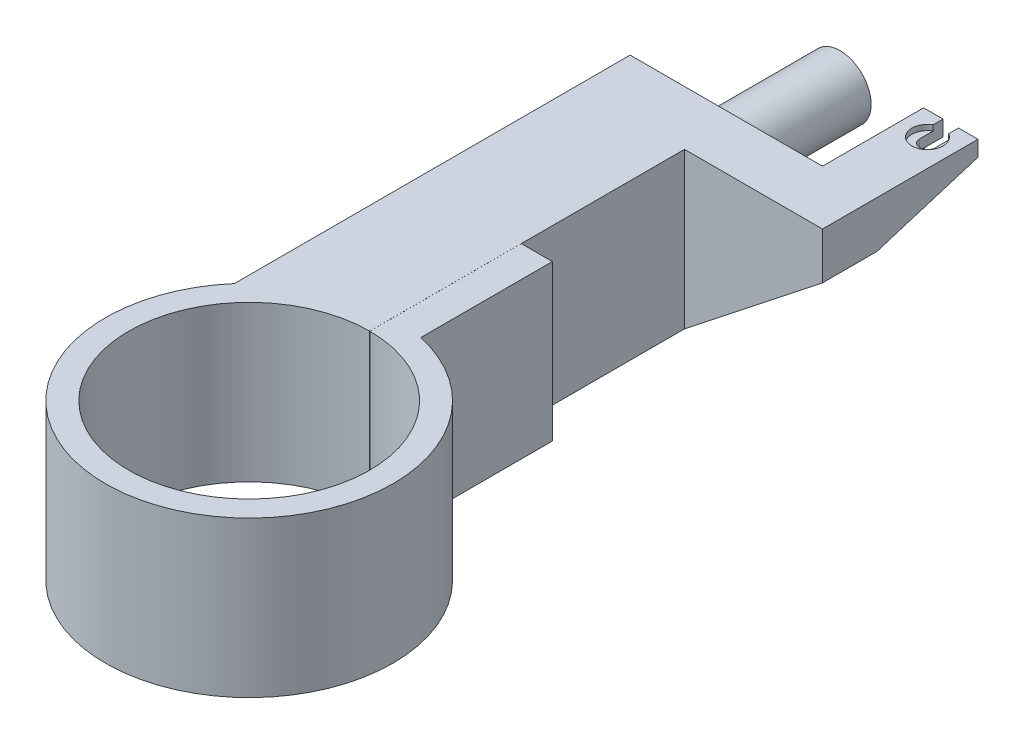
ISO-10303-21;
HEADER;
FILE_DESCRIPTION(('STEP AP214'),'2;1');
FILE_NAME('part.step','',(''),(''),'','','');
FILE_SCHEMA(('AUTOMOTIVE_DESIGN { 1 0 10303 214 1 1 1 1 }'));
ENDSEC;
DATA;
#1=APPLICATION_CONTEXT('core data for automotive mechanical design processes');
#2=APPLICATION_PROTOCOL_DEFINITION('international standard','automotive_design',2000,#1);
#3=PRODUCT_CONTEXT('',#1,'mechanical');
#4=PRODUCT('Part','Part','',(#3));
#5=PRODUCT_RELATED_PRODUCT_CATEGORY('part','',(#4));
#6=PRODUCT_DEFINITION_FORMATION('','',#4);
#7=PRODUCT_DEFINITION_CONTEXT('part definition',#1,'design');
#8=PRODUCT_DEFINITION('design','',#6,#7);
#9=PRODUCT_DEFINITION_SHAPE('','',#8);
#10=(LENGTH_UNIT() NAMED_UNIT(*) SI_UNIT(.MILLI.,.METRE.));
#11=(NAMED_UNIT(*) PLANE_ANGLE_UNIT() SI_UNIT($,.RADIAN.));
#12=(NAMED_UNIT(*) SI_UNIT($,.STERADIAN.) SOLID_ANGLE_UNIT());
#13=UNCERTAINTY_MEASURE_WITH_UNIT(LENGTH_MEASURE(1.E-05),#10,'distance_accuracy_value','');
#14=(GEOMETRIC_REPRESENTATION_CONTEXT(3) GLOBAL_UNCERTAINTY_ASSIGNED_CONTEXT((#13)) GLOBAL_UNIT_ASSIGNED_CONTEXT((#10,
#11,#12)) REPRESENTATION_CONTEXT('',''));
#15=CARTESIAN_POINT('',(0.,0.,0.));
#16=DIRECTION('',(0.,0.,1.));
#17=DIRECTION('',(1.,0.,0.));
#18=AXIS2_PLACEMENT_3D('',#15,#16,#17);
#19=CARTESIAN_POINT('',(-6.99999999999999,10.,83.));
#20=DIRECTION('',(0.,0.,-1.));
#21=DIRECTION('',(-1.,0.,0.));
#22=AXIS2_PLACEMENT_3D('',#19,#20,#21);
#23=CYLINDRICAL_SURFACE('',#22,4.);
#24=CARTESIAN_POINT('',(-6.99999999999999,10.,83.));
#25=DIRECTION('',(0.,0.,1.));
#26=DIRECTION('',(1.,0.,0.));
#27=AXIS2_PLACEMENT_3D('',#24,#25,#26);
#28=CIRCLE('',#27,4.);
#29=CARTESIAN_POINT('',(-2.99999999999999,10.,83.));
#30=VERTEX_POINT('',#29);
#31=EDGE_CURVE('E42',#30,#30,#28,.T.);
#32=ORIENTED_EDGE('',*,*,#31,.T.);
#33=EDGE_LOOP('',(#32));
#34=FACE_BOUND('',#33,.T.);
#35=CARTESIAN_POINT('',(-6.99999999999999,10.,103.));
#36=DIRECTION('',(0.,0.,-1.));
#37=DIRECTION('',(-1.,0.,0.));
#38=AXIS2_PLACEMENT_3D('',#35,#36,#37);
#39=CIRCLE('',#38,4.);
#40=CARTESIAN_POINT('',(-11.,10.,103.));
#41=VERTEX_POINT('',#40);
#42=EDGE_CURVE('E473',#41,#41,#39,.F.);
#43=ORIENTED_EDGE('',*,*,#42,.F.);
#44=EDGE_LOOP('',(#43));
#45=FACE_BOUND('',#44,.T.);
#46=ADVANCED_FACE('F39',(#34,#45),#23,.T.);
#47=CARTESIAN_POINT('',(14.249394375664,18.,93.));
#48=DIRECTION('',(0.,1.,0.));
#49=DIRECTION('',(0.,0.,-1.));
#50=AXIS2_PLACEMENT_3D('',#47,#48,#49);
#51=CYLINDRICAL_SURFACE('',#50,1.);
#52=DIRECTION('',(0.,1.,0.));
#53=VECTOR('',#52,1.);
#54=CARTESIAN_POINT('',(15.249394375664,18.,93.));
#55=LINE('',#54,#53);
#56=CARTESIAN_POINT('',(15.249394375664,18.,93.));
#57=VERTEX_POINT('',#56);
#58=CARTESIAN_POINT('',(15.249394375664,19.3,93.));
#59=VERTEX_POINT('',#58);
#60=EDGE_CURVE('E427',#57,#59,#55,.T.);
#61=ORIENTED_EDGE('',*,*,#60,.F.);
#62=CARTESIAN_POINT('',(14.249394375664,18.,93.));
#63=DIRECTION('',(0.,1.,0.));
#64=DIRECTION('',(0.,0.,-1.));
#65=AXIS2_PLACEMENT_3D('',#62,#63,#64);
#66=CIRCLE('',#65,1.);
#67=CARTESIAN_POINT('',(13.249394375664,18.,93.));
#68=VERTEX_POINT('',#67);
#69=EDGE_CURVE('E390',#68,#57,#66,.T.);
#70=ORIENTED_EDGE('',*,*,#69,.F.);
#71=DIRECTION('',(0.,1.,0.));
#72=VECTOR('',#71,1.);
#73=CARTESIAN_POINT('',(13.249394375664,18.,93.));
#74=LINE('',#73,#72);
#75=CARTESIAN_POINT('',(13.249394375664,19.3,93.));
#76=VERTEX_POINT('',#75);
#77=EDGE_CURVE('E430',#68,#76,#74,.T.);
#78=ORIENTED_EDGE('',*,*,#77,.T.);
#79=CARTESIAN_POINT('',(14.249394375664,19.3,93.));
#80=DIRECTION('',(0.,-1.,0.));
#81=DIRECTION('',(0.,0.,-1.));
#82=AXIS2_PLACEMENT_3D('',#79,#80,#81);
#83=CIRCLE('',#82,1.);
#84=EDGE_CURVE('E328',#59,#76,#83,.T.);
#85=ORIENTED_EDGE('',*,*,#84,.F.);
#86=EDGE_LOOP('',(#61,#70,#78,#85));
#87=FACE_BOUND('',#86,.T.);
#88=ADVANCED_FACE('F497',(#87),#51,.F.);
#89=CARTESIAN_POINT('',(2.,18.,108.));
#90=DIRECTION('',(-1.,0.,0.));
#91=DIRECTION('',(0.,0.,-1.));
#92=AXIS2_PLACEMENT_3D('',#89,#90,#91);
#93=PLANE('',#92);
#94=DIRECTION('',(0.,0.,1.));
#95=VECTOR('',#94,1.);
#96=CARTESIAN_POINT('',(2.,18.,108.));
#97=LINE('',#96,#95);
#98=CARTESIAN_POINT('',(2.,18.,105.));
#99=VERTEX_POINT('',#98);
#100=CARTESIAN_POINT('',(2.,18.,108.));
#101=VERTEX_POINT('',#100);
#102=EDGE_CURVE('E339',#99,#101,#97,.T.);
#103=ORIENTED_EDGE('',*,*,#102,.T.);
#104=DIRECTION('',(0.,1.,0.));
#105=VECTOR('',#104,1.);
#106=CARTESIAN_POINT('',(2.,18.,108.));
#107=LINE('',#106,#105);
#108=CARTESIAN_POINT('',(2.,1.5775186131641,108.));
#109=VERTEX_POINT('',#108);
#110=EDGE_CURVE('E372',#109,#101,#107,.T.);
#111=ORIENTED_EDGE('',*,*,#110,.F.);
#112=DIRECTION('',(0.,0.,1.));
#113=VECTOR('',#112,1.);
#114=CARTESIAN_POINT('',(2.,1.5775186131641,108.));
#115=LINE('',#114,#113);
#116=CARTESIAN_POINT('',(2.,1.5775186131641,105.));
#117=VERTEX_POINT('',#116);
#118=EDGE_CURVE('E355',#117,#109,#115,.T.);
#119=ORIENTED_EDGE('',*,*,#118,.F.);
#120=DIRECTION('',(0.,1.,0.));
#121=VECTOR('',#120,1.);
#122=CARTESIAN_POINT('',(2.,18.,105.));
#123=LINE('',#122,#121);
#124=EDGE_CURVE('E371',#117,#99,#123,.T.);
#125=ORIENTED_EDGE('',*,*,#124,.T.);
#126=EDGE_LOOP('',(#103,#111,#119,#125));
#127=FACE_BOUND('',#126,.T.);
#128=ADVANCED_FACE('F542',(#127),#93,.F.);
#129=CARTESIAN_POINT('',(2.,18.,108.));
#130=DIRECTION('',(0.,0.,1.));
#131=DIRECTION('',(-1.,0.,0.));
#132=AXIS2_PLACEMENT_3D('',#129,#130,#131);
#133=PLANE('',#132);
#134=DIRECTION('',(1.,0.,0.));
#135=VECTOR('',#134,1.);
#136=CARTESIAN_POINT('',(15.749394375664,18.,108.));
#137=LINE('',#136,#135);
#138=CARTESIAN_POINT('',(15.749394375664,18.,108.));
#139=VERTEX_POINT('',#138);
#140=EDGE_CURVE('E336',#101,#139,#137,.T.);
#141=ORIENTED_EDGE('',*,*,#140,.T.);
#142=DIRECTION('',(0.,1.,0.));
#143=VECTOR('',#142,1.);
#144=CARTESIAN_POINT('',(15.749394375664,18.,108.));
#145=LINE('',#144,#143);
#146=CARTESIAN_POINT('',(15.749394375664,12.4224813868359,108.));
#147=VERTEX_POINT('',#146);
#148=EDGE_CURVE('E376',#147,#139,#145,.T.);
#149=ORIENTED_EDGE('',*,*,#148,.F.);
#150=DIRECTION('',(0.785155480925612,0.619298692693978,0.));
#151=VECTOR('',#150,1.);
#152=CARTESIAN_POINT('',(9.98536199063244,7.87604719970196,108.));
#153=LINE('',#152,#151);
#154=EDGE_CURVE('E358',#109,#147,#153,.T.);
#155=ORIENTED_EDGE('',*,*,#154,.F.);
#156=ORIENTED_EDGE('',*,*,#110,.T.);
#157=EDGE_LOOP('',(#141,#149,#155,#156));
#158=FACE_BOUND('',#157,.T.);
#159=ADVANCED_FACE('F538',(#158),#133,.F.);
#160=CARTESIAN_POINT('',(15.749394375664,18.,108.));
#161=DIRECTION('',(1.,0.,0.));
#162=DIRECTION('',(0.,0.,1.));
#163=AXIS2_PLACEMENT_3D('',#160,#161,#162);
#164=PLANE('',#163);
#165=DIRECTION('',(0.,1.,0.));
#166=VECTOR('',#165,1.);
#167=CARTESIAN_POINT('',(15.749394375664,18.,103.));
#168=LINE('',#167,#166);
#169=CARTESIAN_POINT('',(15.749394375664,12.4224813868359,103.));
#170=VERTEX_POINT('',#169);
#171=CARTESIAN_POINT('',(15.749394375664,14.,103.));
#172=VERTEX_POINT('',#171);
#173=EDGE_CURVE('E322',#170,#172,#168,.T.);
#174=ORIENTED_EDGE('',*,*,#173,.F.);
#175=DIRECTION('',(0.,0.,-1.));
#176=VECTOR('',#175,1.);
#177=CARTESIAN_POINT('',(15.749394375664,12.4224813868359,108.));
#178=LINE('',#177,#176);
#179=EDGE_CURVE('E363',#147,#170,#178,.T.);
#180=ORIENTED_EDGE('',*,*,#179,.F.);
#181=ORIENTED_EDGE('',*,*,#148,.T.);
#182=DIRECTION('',(0.,0.,1.));
#183=VECTOR('',#182,1.);
#184=CARTESIAN_POINT('',(15.749394375664,18.,166.));
#185=LINE('',#184,#183);
#186=CARTESIAN_POINT('',(15.749394375664,18.,90.));
#187=VERTEX_POINT('',#186);
#188=EDGE_CURVE('E369',#187,#139,#185,.T.);
#189=ORIENTED_EDGE('',*,*,#188,.F.);
#190=DIRECTION('',(0.,0.294085848837523,-0.95577900872195));
#191=VECTOR('',#190,1.);
#192=CARTESIAN_POINT('',(15.749394375664,12.9405405405405,106.443243243243));
#193=LINE('',#192,#191);
#194=EDGE_CURVE('E313',#172,#187,#193,.T.);
#195=ORIENTED_EDGE('',*,*,#194,.F.);
#196=EDGE_LOOP('',(#174,#180,#181,#189,#195));
#197=FACE_BOUND('',#196,.T.);
#198=ADVANCED_FACE('F535',(#197),#164,.F.);
#199=CARTESIAN_POINT('',(12.749394375664,18.,105.));
#200=DIRECTION('',(-1.,0.,0.));
#201=DIRECTION('',(0.,0.,-1.));
#202=AXIS2_PLACEMENT_3D('',#199,#200,#201);
#203=PLANE('',#202);
#204=DIRECTION('',(0.,0.,1.));
#205=VECTOR('',#204,1.);
#206=CARTESIAN_POINT('',(12.749394375664,18.,166.));
#207=LINE('',#206,#205);
#208=CARTESIAN_POINT('',(12.749394375664,18.,90.));
#209=VERTEX_POINT('',#208);
#210=CARTESIAN_POINT('',(12.749394375664,18.,105.));
#211=VERTEX_POINT('',#210);
#212=EDGE_CURVE('E366',#209,#211,#207,.T.);
#213=ORIENTED_EDGE('',*,*,#212,.T.);
#214=DIRECTION('',(0.,1.,0.));
#215=VECTOR('',#214,1.);
#216=CARTESIAN_POINT('',(12.749394375664,18.,105.));
#217=LINE('',#216,#215);
#218=CARTESIAN_POINT('',(12.749394375664,10.0562034670898,105.));
#219=VERTEX_POINT('',#218);
#220=EDGE_CURVE('E379',#219,#211,#217,.T.);
#221=ORIENTED_EDGE('',*,*,#220,.F.);
#222=DIRECTION('',(0.,0.,1.));
#223=VECTOR('',#222,1.);
#224=CARTESIAN_POINT('',(12.749394375664,10.0562034670898,105.));
#225=LINE('',#224,#223);
#226=CARTESIAN_POINT('',(12.749394375664,10.0562034670898,103.));
#227=VERTEX_POINT('',#226);
#228=EDGE_CURVE('E350',#227,#219,#225,.T.);
#229=ORIENTED_EDGE('',*,*,#228,.F.);
#230=DIRECTION('',(0.,-1.,0.));
#231=VECTOR('',#230,1.);
#232=CARTESIAN_POINT('',(12.749394375664,18.,103.));
#233=LINE('',#232,#231);
#234=CARTESIAN_POINT('',(12.749394375664,14.,103.));
#235=VERTEX_POINT('',#234);
#236=EDGE_CURVE('E319',#235,#227,#233,.T.);
#237=ORIENTED_EDGE('',*,*,#236,.F.);
#238=DIRECTION('',(0.,-0.294085848837523,0.95577900872195));
#239=VECTOR('',#238,1.);
#240=CARTESIAN_POINT('',(12.749394375664,13.7837837837838,103.702702702703));
#241=LINE('',#240,#239);
#242=EDGE_CURVE('E310',#209,#235,#241,.T.);
#243=ORIENTED_EDGE('',*,*,#242,.F.);
#244=EDGE_LOOP('',(#213,#221,#229,#237,#243));
#245=FACE_BOUND('',#244,.T.);
#246=ADVANCED_FACE('F509',(#245),#203,.F.);
#247=CARTESIAN_POINT('',(2.,18.,105.));
#248=DIRECTION('',(0.,0.,-1.));
#249=DIRECTION('',(1.,0.,0.));
#250=AXIS2_PLACEMENT_3D('',#247,#248,#249);
#251=PLANE('',#250);
#252=DIRECTION('',(-1.,0.,0.));
#253=VECTOR('',#252,1.);
#254=CARTESIAN_POINT('',(2.,18.,105.));
#255=LINE('',#254,#253);
#256=EDGE_CURVE('E342',#211,#99,#255,.T.);
#257=ORIENTED_EDGE('',*,*,#256,.T.);
#258=ORIENTED_EDGE('',*,*,#124,.F.);
#259=DIRECTION('',(-0.785155480925612,-0.619298692693978,0.));
#260=VECTOR('',#259,1.);
#261=CARTESIAN_POINT('',(9.98536199063244,7.87604719970196,105.));
#262=LINE('',#261,#260);
#263=EDGE_CURVE('E476',#219,#117,#262,.T.);
#264=ORIENTED_EDGE('',*,*,#263,.F.);
#265=ORIENTED_EDGE('',*,*,#220,.T.);
#266=EDGE_LOOP('',(#257,#258,#264,#265));
#267=FACE_BOUND('',#266,.T.);
#268=ADVANCED_FACE('F546',(#267),#251,.F.);
#269=CARTESIAN_POINT('',(0.,20.,150.5));
#270=DIRECTION('',(-1.,0.,0.));
#271=DIRECTION('',(0.,0.,-1.));
#272=AXIS2_PLACEMENT_3D('',#269,#270,#271);
#273=PLANE('',#272);
#274=DIRECTION('',(0.,1.,0.));
#275=VECTOR('',#274,1.);
#276=CARTESIAN_POINT('',(0.,18.,110.));
#277=LINE('',#276,#275);
#278=CARTESIAN_POINT('',(0.,0.,110.));
#279=VERTEX_POINT('',#278);
#280=CARTESIAN_POINT('',(0.,20.,110.));
#281=VERTEX_POINT('',#280);
#282=EDGE_CURVE('E418',#279,#281,#277,.T.);
#283=ORIENTED_EDGE('',*,*,#282,.T.);
#284=DIRECTION('',(0.,0.,1.));
#285=VECTOR('',#284,1.);
#286=CARTESIAN_POINT('',(0.,20.,150.5));
#287=LINE('',#286,#285);
#288=CARTESIAN_POINT('',(0.,20.,150.5));
#289=VERTEX_POINT('',#288);
#290=EDGE_CURVE('E255',#281,#289,#287,.T.);
#291=ORIENTED_EDGE('',*,*,#290,.T.);
#292=DIRECTION('',(0.,-1.,0.));
#293=VECTOR('',#292,1.);
#294=CARTESIAN_POINT('',(0.,20.,150.5));
#295=LINE('',#294,#293);
#296=CARTESIAN_POINT('',(0.,0.,150.5));
#297=VERTEX_POINT('',#296);
#298=EDGE_CURVE('E251',#289,#297,#295,.T.);
#299=ORIENTED_EDGE('',*,*,#298,.T.);
#300=DIRECTION('',(0.,0.,1.));
#301=VECTOR('',#300,1.);
#302=CARTESIAN_POINT('',(0.,0.,150.5));
#303=LINE('',#302,#301);
#304=EDGE_CURVE('E463',#279,#297,#303,.T.);
#305=ORIENTED_EDGE('',*,*,#304,.F.);
#306=EDGE_LOOP('',(#283,#291,#299,#305));
#307=FACE_BOUND('',#306,.T.);
#308=ADVANCED_FACE('F576',(#307),#273,.F.);
#309=CARTESIAN_POINT('',(14.249394375664,18.,93.));
#310=DIRECTION('',(0.,1.,0.));
#311=DIRECTION('',(0.,0.,-1.));
#312=AXIS2_PLACEMENT_3D('',#309,#310,#311);
#313=PLANE('',#312);
#314=ORIENTED_EDGE('',*,*,#188,.T.);
#315=ORIENTED_EDGE('',*,*,#140,.F.);
#316=ORIENTED_EDGE('',*,*,#102,.F.);
#317=ORIENTED_EDGE('',*,*,#256,.F.);
#318=ORIENTED_EDGE('',*,*,#212,.F.);
#319=DIRECTION('',(1.,0.,0.));
#320=VECTOR('',#319,1.);
#321=CARTESIAN_POINT('',(10.749394375664,18.,90.));
#322=LINE('',#321,#320);
#323=CARTESIAN_POINT('',(13.249394375664,18.,90.));
#324=VERTEX_POINT('',#323);
#325=EDGE_CURVE('E384',#209,#324,#322,.T.);
#326=ORIENTED_EDGE('',*,*,#325,.T.);
#327=DIRECTION('',(0.,0.,1.));
#328=VECTOR('',#327,1.);
#329=CARTESIAN_POINT('',(13.249394375664,18.,93.));
#330=LINE('',#329,#328);
#331=EDGE_CURVE('E387',#324,#68,#330,.T.);
#332=ORIENTED_EDGE('',*,*,#331,.T.);
#333=ORIENTED_EDGE('',*,*,#69,.T.);
#334=DIRECTION('',(0.,0.,-1.));
#335=VECTOR('',#334,1.);
#336=CARTESIAN_POINT('',(15.249394375664,18.,93.));
#337=LINE('',#336,#335);
#338=CARTESIAN_POINT('',(15.249394375664,18.,90.));
#339=VERTEX_POINT('',#338);
#340=EDGE_CURVE('E393',#57,#339,#337,.T.);
#341=ORIENTED_EDGE('',*,*,#340,.T.);
#342=DIRECTION('',(1.,0.,0.));
#343=VECTOR('',#342,1.);
#344=CARTESIAN_POINT('',(15.249394375664,18.,90.));
#345=LINE('',#344,#343);
#346=EDGE_CURVE('E396',#339,#187,#345,.T.);
#347=ORIENTED_EDGE('',*,*,#346,.T.);
#348=EDGE_LOOP('',(#314,#315,#316,#317,#318,#326,#332,#333,#341,#347));
#349=FACE_BOUND('',#348,.T.);
#350=ADVANCED_FACE('F502',(#349),#313,.F.);
#351=CARTESIAN_POINT('',(-14.,20.,103.));
#352=DIRECTION('',(0.,0.,1.));
#353=DIRECTION('',(-1.,0.,0.));
#354=AXIS2_PLACEMENT_3D('',#351,#352,#353);
#355=PLANE('',#354);
#356=DIRECTION('',(1.,0.,0.));
#357=VECTOR('',#356,1.);
#358=CARTESIAN_POINT('',(-13.1780414969752,14.,103.));
#359=LINE('',#358,#357);
#360=CARTESIAN_POINT('',(10.749394375664,14.,103.));
#361=VERTEX_POINT('',#360);
#362=EDGE_CURVE('E317',#361,#235,#359,.T.);
#363=ORIENTED_EDGE('',*,*,#362,.T.);
#364=ORIENTED_EDGE('',*,*,#236,.T.);
#365=DIRECTION('',(0.785155480925612,0.619298692693978,0.));
#366=VECTOR('',#365,1.);
#367=CARTESIAN_POINT('',(1.09434744878945,0.863176734867015,103.));
#368=LINE('',#367,#366);
#369=CARTESIAN_POINT('',(0.,0.,103.));
#370=VERTEX_POINT('',#369);
#371=EDGE_CURVE('E361',#370,#227,#368,.T.);
#372=ORIENTED_EDGE('',*,*,#371,.F.);
#373=DIRECTION('',(1.,0.,0.));
#374=VECTOR('',#373,1.);
#375=CARTESIAN_POINT('',(-14.,0.,103.));
#376=LINE('',#375,#374);
#377=CARTESIAN_POINT('',(-14.,0.,103.));
#378=VERTEX_POINT('',#377);
#379=EDGE_CURVE('E460',#378,#370,#376,.T.);
#380=ORIENTED_EDGE('',*,*,#379,.F.);
#381=DIRECTION('',(0.,-1.,0.));
#382=VECTOR('',#381,1.);
#383=CARTESIAN_POINT('',(-14.,20.,103.));
#384=LINE('',#383,#382);
#385=CARTESIAN_POINT('',(-14.,20.,103.));
#386=VERTEX_POINT('',#385);
#387=EDGE_CURVE('E468',#386,#378,#384,.T.);
#388=ORIENTED_EDGE('',*,*,#387,.F.);
#389=DIRECTION('',(1.,0.,0.));
#390=VECTOR('',#389,1.);
#391=CARTESIAN_POINT('',(-14.,20.,103.));
#392=LINE('',#391,#390);
#393=CARTESIAN_POINT('',(10.749394375664,20.,103.));
#394=VERTEX_POINT('',#393);
#395=EDGE_CURVE('E452',#386,#394,#392,.T.);
#396=ORIENTED_EDGE('',*,*,#395,.T.);
#397=DIRECTION('',(0.,1.,0.));
#398=VECTOR('',#397,1.);
#399=CARTESIAN_POINT('',(10.749394375664,18.,103.));
#400=LINE('',#399,#398);
#401=EDGE_CURVE('E399',#361,#394,#400,.T.);
#402=ORIENTED_EDGE('',*,*,#401,.F.);
#403=EDGE_LOOP('',(#363,#364,#372,#380,#388,#396,#402));
#404=FACE_BOUND('',#403,.T.);
#405=ORIENTED_EDGE('',*,*,#42,.T.);
#406=EDGE_LOOP('',(#405));
#407=FACE_BOUND('',#406,.T.);
#408=ADVANCED_FACE('F552',(#404,#407),#355,.F.);
#409=CARTESIAN_POINT('',(0.,20.,166.));
#410=DIRECTION('',(0.,1.,0.));
#411=DIRECTION('',(0.,0.,-1.));
#412=AXIS2_PLACEMENT_3D('',#409,#410,#411);
#413=PLANE('',#412);
#414=CARTESIAN_POINT('',(14.249394375664,20.,93.));
#415=DIRECTION('',(0.,-1.,0.));
#416=DIRECTION('',(0.,0.,-1.));
#417=AXIS2_PLACEMENT_3D('',#414,#415,#416);
#418=CIRCLE('',#417,2.);
#419=CARTESIAN_POINT('',(15.249394375664,20.,91.2679491924311));
#420=VERTEX_POINT('',#419);
#421=CARTESIAN_POINT('',(13.249394375664,20.,91.2679491924311));
#422=VERTEX_POINT('',#421);
#423=EDGE_CURVE('E325',#420,#422,#418,.T.);
#424=ORIENTED_EDGE('',*,*,#423,.T.);
#425=DIRECTION('',(0.,0.,1.));
#426=VECTOR('',#425,1.);
#427=CARTESIAN_POINT('',(13.249394375664,20.,93.));
#428=LINE('',#427,#426);
#429=CARTESIAN_POINT('',(13.249394375664,20.,90.));
#430=VERTEX_POINT('',#429);
#431=EDGE_CURVE('E405',#430,#422,#428,.T.);
#432=ORIENTED_EDGE('',*,*,#431,.F.);
#433=DIRECTION('',(1.,0.,0.));
#434=VECTOR('',#433,1.);
#435=CARTESIAN_POINT('',(10.749394375664,20.,90.));
#436=LINE('',#435,#434);
#437=CARTESIAN_POINT('',(10.749394375664,20.,90.));
#438=VERTEX_POINT('',#437);
#439=EDGE_CURVE('E402',#438,#430,#436,.T.);
#440=ORIENTED_EDGE('',*,*,#439,.F.);
#441=DIRECTION('',(0.,0.,-1.));
#442=VECTOR('',#441,1.);
#443=CARTESIAN_POINT('',(10.749394375664,20.,103.));
#444=LINE('',#443,#442);
#445=EDGE_CURVE('E375',#394,#438,#444,.T.);
#446=ORIENTED_EDGE('',*,*,#445,.F.);
#447=ORIENTED_EDGE('',*,*,#395,.F.);
#448=DIRECTION('',(0.,0.,-1.));
#449=VECTOR('',#448,1.);
#450=CARTESIAN_POINT('',(-14.,20.,153.906613377552));
#451=LINE('',#450,#449);
#452=CARTESIAN_POINT('',(-14.,20.,153.906613377552));
#453=VERTEX_POINT('',#452);
#454=EDGE_CURVE('E449',#453,#386,#451,.T.);
#455=ORIENTED_EDGE('',*,*,#454,.F.);
#456=CARTESIAN_POINT('',(0.,20.,166.));
#457=DIRECTION('',(0.,-1.,0.));
#458=DIRECTION('',(0.,0.,-1.));
#459=AXIS2_PLACEMENT_3D('',#456,#457,#458);
#460=CIRCLE('',#459,18.5);
#461=CARTESIAN_POINT('',(4.,20.,147.937608131812));
#462=VERTEX_POINT('',#461);
#463=EDGE_CURVE('E446',#462,#453,#460,.T.);
#464=ORIENTED_EDGE('',*,*,#463,.F.);
#465=DIRECTION('',(0.,0.,1.));
#466=VECTOR('',#465,1.);
#467=CARTESIAN_POINT('',(4.00000000000001,20.,131.));
#468=LINE('',#467,#466);
#469=CARTESIAN_POINT('',(4.00000000000001,20.,131.));
#470=VERTEX_POINT('',#469);
#471=EDGE_CURVE('E262',#470,#462,#468,.T.);
#472=ORIENTED_EDGE('',*,*,#471,.F.);
#473=DIRECTION('',(1.,0.,0.));
#474=VECTOR('',#473,1.);
#475=CARTESIAN_POINT('',(0.0100000000000048,20.,131.));
#476=LINE('',#475,#474);
#477=CARTESIAN_POINT('',(0.0100000000000048,20.,131.));
#478=VERTEX_POINT('',#477);
#479=EDGE_CURVE('E261',#478,#470,#476,.T.);
#480=ORIENTED_EDGE('',*,*,#479,.F.);
#481=DIRECTION('',(0.,0.,1.));
#482=VECTOR('',#481,1.);
#483=CARTESIAN_POINT('',(0.0100000000000048,20.,131.));
#484=LINE('',#483,#482);
#485=CARTESIAN_POINT('',(0.01,20.,150.500003225807));
#486=VERTEX_POINT('',#485);
#487=EDGE_CURVE('E238',#478,#486,#484,.T.);
#488=ORIENTED_EDGE('',*,*,#487,.T.);
#489=CARTESIAN_POINT('',(0.,20.,166.));
#490=DIRECTION('',(0.,1.,0.));
#491=DIRECTION('',(0.,0.,-1.));
#492=AXIS2_PLACEMENT_3D('',#489,#490,#491);
#493=CIRCLE('',#492,15.5);
#494=EDGE_CURVE('E248',#289,#486,#493,.T.);
#495=ORIENTED_EDGE('',*,*,#494,.F.);
#496=ORIENTED_EDGE('',*,*,#290,.F.);
#497=DIRECTION('',(-1.,0.,0.));
#498=VECTOR('',#497,1.);
#499=CARTESIAN_POINT('',(17.749394375664,20.,110.));
#500=LINE('',#499,#498);
#501=CARTESIAN_POINT('',(17.749394375664,20.,110.));
#502=VERTEX_POINT('',#501);
#503=EDGE_CURVE('E388',#502,#281,#500,.T.);
#504=ORIENTED_EDGE('',*,*,#503,.F.);
#505=DIRECTION('',(0.,0.,1.));
#506=VECTOR('',#505,1.);
#507=CARTESIAN_POINT('',(17.749394375664,20.,90.));
#508=LINE('',#507,#506);
#509=CARTESIAN_POINT('',(17.749394375664,20.,90.));
#510=VERTEX_POINT('',#509);
#511=EDGE_CURVE('E414',#510,#502,#508,.T.);
#512=ORIENTED_EDGE('',*,*,#511,.F.);
#513=DIRECTION('',(1.,0.,0.));
#514=VECTOR('',#513,1.);
#515=CARTESIAN_POINT('',(15.249394375664,20.,90.));
#516=LINE('',#515,#514);
#517=CARTESIAN_POINT('',(15.249394375664,20.,90.));
#518=VERTEX_POINT('',#517);
#519=EDGE_CURVE('E411',#518,#510,#516,.T.);
#520=ORIENTED_EDGE('',*,*,#519,.F.);
#521=DIRECTION('',(0.,0.,-1.));
#522=VECTOR('',#521,1.);
#523=CARTESIAN_POINT('',(15.249394375664,20.,93.));
#524=LINE('',#523,#522);
#525=EDGE_CURVE('E408',#420,#518,#524,.T.);
#526=ORIENTED_EDGE('',*,*,#525,.F.);
#527=EDGE_LOOP('',(#424,#432,#440,#446,#447,#455,#464,#472,#480,#488,#495,#496,#504,#512,#520,#526));
#528=FACE_BOUND('',#527,.T.);
#529=ADVANCED_FACE('F258',(#528),#413,.T.);
#530=CARTESIAN_POINT('',(0.,0.,166.));
#531=DIRECTION('',(0.,1.,0.));
#532=DIRECTION('',(0.,0.,-1.));
#533=AXIS2_PLACEMENT_3D('',#530,#531,#532);
#534=PLANE('',#533);
#535=ORIENTED_EDGE('',*,*,#304,.T.);
#536=CARTESIAN_POINT('',(0.,0.,166.));
#537=DIRECTION('',(0.,1.,0.));
#538=DIRECTION('',(0.,0.,-1.));
#539=AXIS2_PLACEMENT_3D('',#536,#537,#538);
#540=CIRCLE('',#539,15.5);
#541=CARTESIAN_POINT('',(0.01,0.,150.500003225807));
#542=VERTEX_POINT('',#541);
#543=EDGE_CURVE('E450',#297,#542,#540,.T.);
#544=ORIENTED_EDGE('',*,*,#543,.T.);
#545=DIRECTION('',(0.,0.,-1.));
#546=VECTOR('',#545,1.);
#547=CARTESIAN_POINT('',(0.0100000000000048,0.,131.));
#548=LINE('',#547,#546);
#549=CARTESIAN_POINT('',(0.0100000000000048,0.,131.));
#550=VERTEX_POINT('',#549);
#551=EDGE_CURVE('E241',#542,#550,#548,.T.);
#552=ORIENTED_EDGE('',*,*,#551,.T.);
#553=DIRECTION('',(-1.,0.,0.));
#554=VECTOR('',#553,1.);
#555=CARTESIAN_POINT('',(0.0100000000000048,0.,131.));
#556=LINE('',#555,#554);
#557=CARTESIAN_POINT('',(4.00000000000001,0.,131.));
#558=VERTEX_POINT('',#557);
#559=EDGE_CURVE('E276',#558,#550,#556,.T.);
#560=ORIENTED_EDGE('',*,*,#559,.F.);
#561=DIRECTION('',(0.,0.,-1.));
#562=VECTOR('',#561,1.);
#563=CARTESIAN_POINT('',(4.00000000000001,0.,131.));
#564=LINE('',#563,#562);
#565=CARTESIAN_POINT('',(4.,0.,147.937608131812));
#566=VERTEX_POINT('',#565);
#567=EDGE_CURVE('E244',#566,#558,#564,.T.);
#568=ORIENTED_EDGE('',*,*,#567,.F.);
#569=CARTESIAN_POINT('',(0.,0.,166.));
#570=DIRECTION('',(0.,-1.,0.));
#571=DIRECTION('',(0.,0.,-1.));
#572=AXIS2_PLACEMENT_3D('',#569,#570,#571);
#573=CIRCLE('',#572,18.5);
#574=CARTESIAN_POINT('',(-14.,0.,153.906613377552));
#575=VERTEX_POINT('',#574);
#576=EDGE_CURVE('E445',#566,#575,#573,.T.);
#577=ORIENTED_EDGE('',*,*,#576,.T.);
#578=DIRECTION('',(0.,0.,-1.));
#579=VECTOR('',#578,1.);
#580=CARTESIAN_POINT('',(-14.,0.,153.906613377552));
#581=LINE('',#580,#579);
#582=EDGE_CURVE('E458',#575,#378,#581,.T.);
#583=ORIENTED_EDGE('',*,*,#582,.T.);
#584=ORIENTED_EDGE('',*,*,#379,.T.);
#585=DIRECTION('',(0.,0.,1.));
#586=VECTOR('',#585,1.);
#587=CARTESIAN_POINT('',(0.,0.,88.));
#588=LINE('',#587,#586);
#589=EDGE_CURVE('E347',#370,#279,#588,.T.);
#590=ORIENTED_EDGE('',*,*,#589,.T.);
#591=EDGE_LOOP('',(#535,#544,#552,#560,#568,#577,#583,#584,#590));
#592=FACE_BOUND('',#591,.T.);
#593=ADVANCED_FACE('F572',(#592),#534,.F.);
#594=CARTESIAN_POINT('',(0.,20.,166.));
#595=DIRECTION('',(0.,-1.,0.));
#596=DIRECTION('',(0.,0.,1.));
#597=AXIS2_PLACEMENT_3D('',#594,#595,#596);
#598=CYLINDRICAL_SURFACE('',#597,18.5);
#599=ORIENTED_EDGE('',*,*,#576,.F.);
#600=DIRECTION('',(0.,1.,0.));
#601=VECTOR('',#600,1.);
#602=CARTESIAN_POINT('',(4.,-56.6083032778761,147.937608131812));
#603=LINE('',#602,#601);
#604=EDGE_CURVE('E245',#566,#462,#603,.T.);
#605=ORIENTED_EDGE('',*,*,#604,.T.);
#606=ORIENTED_EDGE('',*,*,#463,.T.);
#607=DIRECTION('',(0.,-1.,0.));
#608=VECTOR('',#607,1.);
#609=CARTESIAN_POINT('',(-14.,20.,153.906613377552));
#610=LINE('',#609,#608);
#611=EDGE_CURVE('E471',#453,#575,#610,.T.);
#612=ORIENTED_EDGE('',*,*,#611,.T.);
#613=EDGE_LOOP('',(#599,#605,#606,#612));
#614=FACE_BOUND('',#613,.T.);
#615=ADVANCED_FACE('F563',(#614),#598,.T.);
#616=CARTESIAN_POINT('',(-14.,20.,153.906613377552));
#617=DIRECTION('',(1.,0.,0.));
#618=DIRECTION('',(0.,0.,1.));
#619=AXIS2_PLACEMENT_3D('',#616,#617,#618);
#620=PLANE('',#619);
#621=ORIENTED_EDGE('',*,*,#582,.F.);
#622=ORIENTED_EDGE('',*,*,#611,.F.);
#623=ORIENTED_EDGE('',*,*,#454,.T.);
#624=ORIENTED_EDGE('',*,*,#387,.T.);
#625=EDGE_LOOP('',(#621,#622,#623,#624));
#626=FACE_BOUND('',#625,.T.);
#627=ADVANCED_FACE('F560',(#626),#620,.F.);
#628=CARTESIAN_POINT('',(0.,20.,166.));
#629=DIRECTION('',(0.,-1.,0.));
#630=DIRECTION('',(0.,0.,1.));
#631=AXIS2_PLACEMENT_3D('',#628,#629,#630);
#632=CYLINDRICAL_SURFACE('',#631,15.5);
#633=ORIENTED_EDGE('',*,*,#543,.F.);
#634=ORIENTED_EDGE('',*,*,#298,.F.);
#635=ORIENTED_EDGE('',*,*,#494,.T.);
#636=DIRECTION('',(0.,1.,0.));
#637=VECTOR('',#636,1.);
#638=CARTESIAN_POINT('',(0.01,-56.6083032778761,150.500003225807));
#639=LINE('',#638,#637);
#640=EDGE_CURVE('E234',#542,#486,#639,.T.);
#641=ORIENTED_EDGE('',*,*,#640,.F.);
#642=EDGE_LOOP('',(#633,#634,#635,#641));
#643=FACE_BOUND('',#642,.T.);
#644=ADVANCED_FACE('F249',(#643),#632,.F.);
#645=CARTESIAN_POINT('',(17.749394375664,18.,110.));
#646=DIRECTION('',(0.,0.,1.));
#647=DIRECTION('',(-1.,0.,0.));
#648=AXIS2_PLACEMENT_3D('',#645,#646,#647);
#649=PLANE('',#648);
#650=DIRECTION('',(0.785155480925612,0.619298692693978,0.));
#651=VECTOR('',#650,1.);
#652=CARTESIAN_POINT('',(0.,0.,110.));
#653=LINE('',#652,#651);
#654=CARTESIAN_POINT('',(17.749394375664,14.,110.));
#655=VERTEX_POINT('',#654);
#656=EDGE_CURVE('E344',#279,#655,#653,.T.);
#657=ORIENTED_EDGE('',*,*,#656,.T.);
#658=DIRECTION('',(0.,1.,0.));
#659=VECTOR('',#658,1.);
#660=CARTESIAN_POINT('',(17.749394375664,18.,110.));
#661=LINE('',#660,#659);
#662=EDGE_CURVE('E421',#655,#502,#661,.T.);
#663=ORIENTED_EDGE('',*,*,#662,.T.);
#664=ORIENTED_EDGE('',*,*,#503,.T.);
#665=ORIENTED_EDGE('',*,*,#282,.F.);
#666=EDGE_LOOP('',(#657,#663,#664,#665));
#667=FACE_BOUND('',#666,.T.);
#668=ADVANCED_FACE('F579',(#667),#649,.T.);
#669=CARTESIAN_POINT('',(17.749394375664,18.,90.));
#670=DIRECTION('',(1.,0.,0.));
#671=DIRECTION('',(0.,0.,1.));
#672=AXIS2_PLACEMENT_3D('',#669,#670,#671);
#673=PLANE('',#672);
#674=DIRECTION('',(0.,0.294085848837523,-0.95577900872195));
#675=VECTOR('',#674,1.);
#676=CARTESIAN_POINT('',(17.749394375664,14.,103.));
#677=LINE('',#676,#675);
#678=CARTESIAN_POINT('',(17.749394375664,14.,103.));
#679=VERTEX_POINT('',#678);
#680=CARTESIAN_POINT('',(17.749394375664,18.,90.));
#681=VERTEX_POINT('',#680);
#682=EDGE_CURVE('E302',#679,#681,#677,.T.);
#683=ORIENTED_EDGE('',*,*,#682,.T.);
#684=DIRECTION('',(0.,1.,0.));
#685=VECTOR('',#684,1.);
#686=CARTESIAN_POINT('',(17.749394375664,18.,90.));
#687=LINE('',#686,#685);
#688=EDGE_CURVE('E423',#681,#510,#687,.T.);
#689=ORIENTED_EDGE('',*,*,#688,.T.);
#690=ORIENTED_EDGE('',*,*,#511,.T.);
#691=ORIENTED_EDGE('',*,*,#662,.F.);
#692=DIRECTION('',(0.,0.,1.));
#693=VECTOR('',#692,1.);
#694=CARTESIAN_POINT('',(17.749394375664,14.,88.));
#695=LINE('',#694,#693);
#696=EDGE_CURVE('E348',#679,#655,#695,.T.);
#697=ORIENTED_EDGE('',*,*,#696,.F.);
#698=EDGE_LOOP('',(#683,#689,#690,#691,#697));
#699=FACE_BOUND('',#698,.T.);
#700=ADVANCED_FACE('F583',(#699),#673,.T.);
#701=CARTESIAN_POINT('',(15.249394375664,18.,90.));
#702=DIRECTION('',(0.,0.,-1.));
#703=DIRECTION('',(1.,0.,0.));
#704=AXIS2_PLACEMENT_3D('',#701,#702,#703);
#705=PLANE('',#704);
#706=DIRECTION('',(1.,0.,0.));
#707=VECTOR('',#706,1.);
#708=CARTESIAN_POINT('',(-3.47890914337223,18.,90.));
#709=LINE('',#708,#707);
#710=EDGE_CURVE('E307',#187,#681,#709,.T.);
#711=ORIENTED_EDGE('',*,*,#710,.F.);
#712=ORIENTED_EDGE('',*,*,#346,.F.);
#713=DIRECTION('',(0.,1.,0.));
#714=VECTOR('',#713,1.);
#715=CARTESIAN_POINT('',(15.249394375664,18.,90.));
#716=LINE('',#715,#714);
#717=EDGE_CURVE('E425',#339,#518,#716,.T.);
#718=ORIENTED_EDGE('',*,*,#717,.T.);
#719=ORIENTED_EDGE('',*,*,#519,.T.);
#720=ORIENTED_EDGE('',*,*,#688,.F.);
#721=EDGE_LOOP('',(#711,#712,#718,#719,#720));
#722=FACE_BOUND('',#721,.T.);
#723=ADVANCED_FACE('F584',(#722),#705,.T.);
#724=CARTESIAN_POINT('',(15.249394375664,18.,93.));
#725=DIRECTION('',(-1.,0.,0.));
#726=DIRECTION('',(0.,0.,-1.));
#727=AXIS2_PLACEMENT_3D('',#724,#725,#726);
#728=PLANE('',#727);
#729=DIRECTION('',(0.,1.,0.));
#730=VECTOR('',#729,1.);
#731=CARTESIAN_POINT('',(15.249394375664,19.3,91.2679491924311));
#732=LINE('',#731,#730);
#733=CARTESIAN_POINT('',(15.249394375664,19.3,91.2679491924311));
#734=VERTEX_POINT('',#733);
#735=EDGE_CURVE('E334',#734,#420,#732,.T.);
#736=ORIENTED_EDGE('',*,*,#735,.T.);
#737=ORIENTED_EDGE('',*,*,#525,.T.);
#738=ORIENTED_EDGE('',*,*,#717,.F.);
#739=ORIENTED_EDGE('',*,*,#340,.F.);
#740=ORIENTED_EDGE('',*,*,#60,.T.);
#741=DIRECTION('',(0.,0.,1.));
#742=VECTOR('',#741,1.);
#743=CARTESIAN_POINT('',(15.249394375664,19.3,93.));
#744=LINE('',#743,#742);
#745=EDGE_CURVE('E332',#734,#59,#744,.T.);
#746=ORIENTED_EDGE('',*,*,#745,.F.);
#747=EDGE_LOOP('',(#736,#737,#738,#739,#740,#746));
#748=FACE_BOUND('',#747,.T.);
#749=ADVANCED_FACE('F524',(#748),#728,.T.);
#750=CARTESIAN_POINT('',(13.249394375664,18.,93.));
#751=DIRECTION('',(1.,0.,0.));
#752=DIRECTION('',(0.,0.,1.));
#753=AXIS2_PLACEMENT_3D('',#750,#751,#752);
#754=PLANE('',#753);
#755=DIRECTION('',(0.,1.,0.));
#756=VECTOR('',#755,1.);
#757=CARTESIAN_POINT('',(13.249394375664,19.3,91.2679491924311));
#758=LINE('',#757,#756);
#759=CARTESIAN_POINT('',(13.249394375664,19.3,91.2679491924311));
#760=VERTEX_POINT('',#759);
#761=EDGE_CURVE('E47',#422,#760,#758,.F.);
#762=ORIENTED_EDGE('',*,*,#761,.T.);
#763=DIRECTION('',(0.,0.,-1.));
#764=VECTOR('',#763,1.);
#765=CARTESIAN_POINT('',(13.249394375664,19.3,93.));
#766=LINE('',#765,#764);
#767=EDGE_CURVE('E478',#76,#760,#766,.T.);
#768=ORIENTED_EDGE('',*,*,#767,.F.);
#769=ORIENTED_EDGE('',*,*,#77,.F.);
#770=ORIENTED_EDGE('',*,*,#331,.F.);
#771=DIRECTION('',(0.,1.,0.));
#772=VECTOR('',#771,1.);
#773=CARTESIAN_POINT('',(13.249394375664,18.,90.));
#774=LINE('',#773,#772);
#775=EDGE_CURVE('E433',#324,#430,#774,.T.);
#776=ORIENTED_EDGE('',*,*,#775,.T.);
#777=ORIENTED_EDGE('',*,*,#431,.T.);
#778=EDGE_LOOP('',(#762,#768,#769,#770,#776,#777));
#779=FACE_BOUND('',#778,.T.);
#780=ADVANCED_FACE('F483',(#779),#754,.T.);
#781=CARTESIAN_POINT('',(10.749394375664,18.,90.));
#782=DIRECTION('',(0.,0.,-1.));
#783=DIRECTION('',(1.,0.,0.));
#784=AXIS2_PLACEMENT_3D('',#781,#782,#783);
#785=PLANE('',#784);
#786=CARTESIAN_POINT('',(10.749394375664,18.,90.));
#787=VERTEX_POINT('',#786);
#788=EDGE_CURVE('E308',#787,#209,#709,.T.);
#789=ORIENTED_EDGE('',*,*,#788,.F.);
#790=DIRECTION('',(0.,1.,0.));
#791=VECTOR('',#790,1.);
#792=CARTESIAN_POINT('',(10.749394375664,18.,90.));
#793=LINE('',#792,#791);
#794=EDGE_CURVE('E435',#787,#438,#793,.T.);
#795=ORIENTED_EDGE('',*,*,#794,.T.);
#796=ORIENTED_EDGE('',*,*,#439,.T.);
#797=ORIENTED_EDGE('',*,*,#775,.F.);
#798=ORIENTED_EDGE('',*,*,#325,.F.);
#799=EDGE_LOOP('',(#789,#795,#796,#797,#798));
#800=FACE_BOUND('',#799,.T.);
#801=ADVANCED_FACE('F506',(#800),#785,.T.);
#802=CARTESIAN_POINT('',(10.749394375664,18.,103.));
#803=DIRECTION('',(-1.,0.,0.));
#804=DIRECTION('',(0.,0.,-1.));
#805=AXIS2_PLACEMENT_3D('',#802,#803,#804);
#806=PLANE('',#805);
#807=DIRECTION('',(0.,0.294085848837523,-0.95577900872195));
#808=VECTOR('',#807,1.);
#809=CARTESIAN_POINT('',(10.749394375664,14.,103.));
#810=LINE('',#809,#808);
#811=EDGE_CURVE('E305',#361,#787,#810,.T.);
#812=ORIENTED_EDGE('',*,*,#811,.F.);
#813=ORIENTED_EDGE('',*,*,#401,.T.);
#814=ORIENTED_EDGE('',*,*,#445,.T.);
#815=ORIENTED_EDGE('',*,*,#794,.F.);
#816=EDGE_LOOP('',(#812,#813,#814,#815));
#817=FACE_BOUND('',#816,.T.);
#818=ADVANCED_FACE('F518',(#817),#806,.T.);
#819=CARTESIAN_POINT('',(0.,0.,88.));
#820=DIRECTION('',(-0.619298692693978,0.785155480925612,0.));
#821=DIRECTION('',(-0.785155480925612,-0.619298692693978,0.));
#822=AXIS2_PLACEMENT_3D('',#819,#820,#821);
#823=PLANE('',#822);
#824=ORIENTED_EDGE('',*,*,#696,.T.);
#825=ORIENTED_EDGE('',*,*,#656,.F.);
#826=ORIENTED_EDGE('',*,*,#589,.F.);
#827=ORIENTED_EDGE('',*,*,#371,.T.);
#828=ORIENTED_EDGE('',*,*,#228,.T.);
#829=ORIENTED_EDGE('',*,*,#263,.T.);
#830=ORIENTED_EDGE('',*,*,#118,.T.);
#831=ORIENTED_EDGE('',*,*,#154,.T.);
#832=ORIENTED_EDGE('',*,*,#179,.T.);
#833=DIRECTION('',(-0.785155480925612,-0.619298692693978,0.));
#834=VECTOR('',#833,1.);
#835=CARTESIAN_POINT('',(0.,0.,103.));
#836=LINE('',#835,#834);
#837=EDGE_CURVE('E11',#679,#170,#836,.T.);
#838=ORIENTED_EDGE('',*,*,#837,.F.);
#839=EDGE_LOOP('',(#824,#825,#826,#827,#828,#829,#830,#831,#832,#838));
#840=FACE_BOUND('',#839,.T.);
#841=ADVANCED_FACE('F548',(#840),#823,.F.);
#842=CARTESIAN_POINT('',(14.249394375664,19.3,93.));
#843=DIRECTION('',(0.,1.,0.));
#844=DIRECTION('',(0.,0.,-1.));
#845=AXIS2_PLACEMENT_3D('',#842,#843,#844);
#846=CYLINDRICAL_SURFACE('',#845,2.);
#847=ORIENTED_EDGE('',*,*,#735,.F.);
#848=CARTESIAN_POINT('',(14.249394375664,19.3,93.));
#849=DIRECTION('',(0.,-1.,0.));
#850=DIRECTION('',(0.,0.,-1.));
#851=AXIS2_PLACEMENT_3D('',#848,#849,#850);
#852=CIRCLE('',#851,2.);
#853=EDGE_CURVE('E326',#734,#760,#852,.T.);
#854=ORIENTED_EDGE('',*,*,#853,.T.);
#855=ORIENTED_EDGE('',*,*,#761,.F.);
#856=ORIENTED_EDGE('',*,*,#423,.F.);
#857=EDGE_LOOP('',(#847,#854,#855,#856));
#858=FACE_BOUND('',#857,.T.);
#859=ADVANCED_FACE('F489',(#858),#846,.F.);
#860=CARTESIAN_POINT('',(14.249394375664,19.3,93.));
#861=DIRECTION('',(0.,1.,0.));
#862=DIRECTION('',(0.,0.,-1.));
#863=AXIS2_PLACEMENT_3D('',#860,#861,#862);
#864=PLANE('',#863);
#865=ORIENTED_EDGE('',*,*,#853,.F.);
#866=ORIENTED_EDGE('',*,*,#745,.T.);
#867=ORIENTED_EDGE('',*,*,#84,.T.);
#868=ORIENTED_EDGE('',*,*,#767,.T.);
#869=EDGE_LOOP('',(#865,#866,#867,#868));
#870=FACE_BOUND('',#869,.T.);
#871=ADVANCED_FACE('F492',(#870),#864,.T.);
#872=CARTESIAN_POINT('',(-13.1780414969752,0.415062819725904,103.));
#873=DIRECTION('',(0.,0.,1.));
#874=DIRECTION('',(-1.,0.,0.));
#875=AXIS2_PLACEMENT_3D('',#872,#873,#874);
#876=PLANE('',#875);
#877=ORIENTED_EDGE('',*,*,#837,.T.);
#878=ORIENTED_EDGE('',*,*,#173,.T.);
#879=EDGE_CURVE('E316',#172,#679,#359,.T.);
#880=ORIENTED_EDGE('',*,*,#879,.T.);
#881=EDGE_LOOP('',(#877,#878,#880));
#882=FACE_BOUND('',#881,.T.);
#883=ADVANCED_FACE('F646',(#882),#876,.F.);
#884=CARTESIAN_POINT('',(-3.47890914337223,14.,103.));
#885=DIRECTION('',(0.,0.95577900872195,0.294085848837523));
#886=DIRECTION('',(0.,0.294085848837523,-0.95577900872195));
#887=AXIS2_PLACEMENT_3D('',#884,#885,#886);
#888=PLANE('',#887);
#889=ORIENTED_EDGE('',*,*,#879,.F.);
#890=ORIENTED_EDGE('',*,*,#194,.T.);
#891=ORIENTED_EDGE('',*,*,#710,.T.);
#892=ORIENTED_EDGE('',*,*,#682,.F.);
#893=EDGE_LOOP('',(#889,#890,#891,#892));
#894=FACE_BOUND('',#893,.T.);
#895=ADVANCED_FACE('F530',(#894),#888,.F.);
#896=ORIENTED_EDGE('',*,*,#788,.T.);
#897=ORIENTED_EDGE('',*,*,#242,.T.);
#898=ORIENTED_EDGE('',*,*,#362,.F.);
#899=ORIENTED_EDGE('',*,*,#811,.T.);
#900=EDGE_LOOP('',(#896,#897,#898,#899));
#901=FACE_BOUND('',#900,.T.);
#902=ADVANCED_FACE('F514',(#901),#888,.F.);
#903=CARTESIAN_POINT('',(0.0100000000000048,-56.6083032778761,131.));
#904=DIRECTION('',(1.,0.,0.));
#905=DIRECTION('',(0.,0.,1.));
#906=AXIS2_PLACEMENT_3D('',#903,#904,#905);
#907=PLANE('',#906);
#908=ORIENTED_EDGE('',*,*,#640,.T.);
#909=ORIENTED_EDGE('',*,*,#487,.F.);
#910=DIRECTION('',(0.,1.,0.));
#911=VECTOR('',#910,1.);
#912=CARTESIAN_POINT('',(0.0100000000000048,-56.6083032778761,131.));
#913=LINE('',#912,#911);
#914=EDGE_CURVE('E271',#550,#478,#913,.T.);
#915=ORIENTED_EDGE('',*,*,#914,.F.);
#916=ORIENTED_EDGE('',*,*,#551,.F.);
#917=EDGE_LOOP('',(#908,#909,#915,#916));
#918=FACE_BOUND('',#917,.T.);
#919=ADVANCED_FACE('F236',(#918),#907,.F.);
#920=CARTESIAN_POINT('',(4.00000000000001,-56.6083032778761,131.));
#921=DIRECTION('',(1.,0.,0.));
#922=DIRECTION('',(0.,0.,1.));
#923=AXIS2_PLACEMENT_3D('',#920,#921,#922);
#924=PLANE('',#923);
#925=ORIENTED_EDGE('',*,*,#567,.T.);
#926=DIRECTION('',(0.,1.,0.));
#927=VECTOR('',#926,1.);
#928=CARTESIAN_POINT('',(4.00000000000001,-56.6083032778761,131.));
#929=LINE('',#928,#927);
#930=EDGE_CURVE('E273',#558,#470,#929,.T.);
#931=ORIENTED_EDGE('',*,*,#930,.T.);
#932=ORIENTED_EDGE('',*,*,#471,.T.);
#933=ORIENTED_EDGE('',*,*,#604,.F.);
#934=EDGE_LOOP('',(#925,#931,#932,#933));
#935=FACE_BOUND('',#934,.T.);
#936=ADVANCED_FACE('F567',(#935),#924,.T.);
#937=CARTESIAN_POINT('',(0.0100000000000048,-56.6083032778761,131.));
#938=DIRECTION('',(0.,0.,-1.));
#939=DIRECTION('',(1.,0.,0.));
#940=AXIS2_PLACEMENT_3D('',#937,#938,#939);
#941=PLANE('',#940);
#942=ORIENTED_EDGE('',*,*,#559,.T.);
#943=ORIENTED_EDGE('',*,*,#914,.T.);
#944=ORIENTED_EDGE('',*,*,#479,.T.);
#945=ORIENTED_EDGE('',*,*,#930,.F.);
#946=EDGE_LOOP('',(#942,#943,#944,#945));
#947=FACE_BOUND('',#946,.T.);
#948=ADVANCED_FACE('F570',(#947),#941,.T.);
#949=CARTESIAN_POINT('',(0.,0.,83.));
#950=DIRECTION('',(0.,0.,1.));
#951=DIRECTION('',(1.,0.,0.));
#952=AXIS2_PLACEMENT_3D('',#949,#950,#951);
#953=PLANE('',#952);
#954=ORIENTED_EDGE('',*,*,#31,.F.);
#955=EDGE_LOOP('',(#954));
#956=FACE_BOUND('',#955,.T.);
#957=ADVANCED_FACE('F668',(#956),#953,.F.);
#958=CLOSED_SHELL('',(#46,#88,#128,#159,#198,#246,#268,#308,#350,#408,#529,#593,#615,#627,#644,
#668,#700,#723,#749,#780,#801,#818,#841,#859,#871,#883,#895,#902,#919,#936,#948,#957));
#959=CARTESIAN_POINT('',(0.,2.,166.));
#960=DIRECTION('',(0.,-1.,0.));
#961=DIRECTION('',(0.,0.,1.));
#962=AXIS2_PLACEMENT_3D('',#959,#960,#961);
#963=PLANE('',#962);
#964=CARTESIAN_POINT('',(0.,2.,166.));
#965=DIRECTION('',(0.,-1.,0.));
#966=DIRECTION('',(0.,0.,1.));
#967=AXIS2_PLACEMENT_3D('',#964,#965,#966);
#968=CIRCLE('',#967,18.5);
#969=CARTESIAN_POINT('',(-11.,2.,151.125525219356));
#970=VERTEX_POINT('',#969);
#971=CARTESIAN_POINT('',(-2.99999999999999,2.,147.744863736471));
#972=VERTEX_POINT('',#971);
#973=EDGE_CURVE('E279',#970,#972,#968,.T.);
#974=ORIENTED_EDGE('',*,*,#973,.T.);
#975=DIRECTION('',(0.,0.,-1.));
#976=VECTOR('',#975,1.);
#977=CARTESIAN_POINT('',(-2.99999999999999,2.,106.));
#978=LINE('',#977,#976);
#979=CARTESIAN_POINT('',(-2.99999999999999,2.,106.));
#980=VERTEX_POINT('',#979);
#981=EDGE_CURVE('E282',#972,#980,#978,.T.);
#982=ORIENTED_EDGE('',*,*,#981,.T.);
#983=DIRECTION('',(-1.,0.,0.));
#984=VECTOR('',#983,1.);
#985=CARTESIAN_POINT('',(-11.,2.,106.));
#986=LINE('',#985,#984);
#987=CARTESIAN_POINT('',(-11.,2.,106.));
#988=VERTEX_POINT('',#987);
#989=EDGE_CURVE('E285',#980,#988,#986,.T.);
#990=ORIENTED_EDGE('',*,*,#989,.T.);
#991=DIRECTION('',(0.,0.,1.));
#992=VECTOR('',#991,1.);
#993=CARTESIAN_POINT('',(-11.,2.,151.125525219356));
#994=LINE('',#993,#992);
#995=EDGE_CURVE('E288',#988,#970,#994,.T.);
#996=ORIENTED_EDGE('',*,*,#995,.T.);
#997=EDGE_LOOP('',(#974,#982,#990,#996));
#998=FACE_BOUND('',#997,.T.);
#999=ADVANCED_FACE('F656',(#998),#963,.F.);
#1000=CARTESIAN_POINT('',(0.,18.,166.));
#1001=DIRECTION('',(0.,1.,0.));
#1002=DIRECTION('',(0.,0.,-1.));
#1003=AXIS2_PLACEMENT_3D('',#1000,#1001,#1002);
#1004=PLANE('',#1003);
#1005=CARTESIAN_POINT('',(0.,18.,166.));
#1006=DIRECTION('',(0.,-1.,0.));
#1007=DIRECTION('',(0.,0.,-1.));
#1008=AXIS2_PLACEMENT_3D('',#1005,#1006,#1007);
#1009=CIRCLE('',#1008,18.5);
#1010=CARTESIAN_POINT('',(-11.,18.,151.125525219356));
#1011=VERTEX_POINT('',#1010);
#1012=CARTESIAN_POINT('',(-2.99999999999999,18.,147.744863736471));
#1013=VERTEX_POINT('',#1012);
#1014=EDGE_CURVE('E290',#1011,#1013,#1009,.T.);
#1015=ORIENTED_EDGE('',*,*,#1014,.F.);
#1016=DIRECTION('',(0.,0.,-1.));
#1017=VECTOR('',#1016,1.);
#1018=CARTESIAN_POINT('',(-11.,18.,151.125525219356));
#1019=LINE('',#1018,#1017);
#1020=CARTESIAN_POINT('',(-11.,18.,106.));
#1021=VERTEX_POINT('',#1020);
#1022=EDGE_CURVE('E299',#1011,#1021,#1019,.T.);
#1023=ORIENTED_EDGE('',*,*,#1022,.T.);
#1024=DIRECTION('',(1.,0.,0.));
#1025=VECTOR('',#1024,1.);
#1026=CARTESIAN_POINT('',(-11.,18.,106.));
#1027=LINE('',#1026,#1025);
#1028=CARTESIAN_POINT('',(-2.99999999999999,18.,106.));
#1029=VERTEX_POINT('',#1028);
#1030=EDGE_CURVE('E296',#1021,#1029,#1027,.T.);
#1031=ORIENTED_EDGE('',*,*,#1030,.T.);
#1032=DIRECTION('',(0.,0.,1.));
#1033=VECTOR('',#1032,1.);
#1034=CARTESIAN_POINT('',(-2.99999999999999,18.,106.));
#1035=LINE('',#1034,#1033);
#1036=EDGE_CURVE('E293',#1029,#1013,#1035,.T.);
#1037=ORIENTED_EDGE('',*,*,#1036,.T.);
#1038=EDGE_LOOP('',(#1015,#1023,#1031,#1037));
#1039=FACE_BOUND('',#1038,.T.);
#1040=ADVANCED_FACE('F652',(#1039),#1004,.F.);
#1041=CARTESIAN_POINT('',(-11.,20.,106.));
#1042=DIRECTION('',(1.,0.,0.));
#1043=DIRECTION('',(0.,0.,1.));
#1044=AXIS2_PLACEMENT_3D('',#1041,#1042,#1043);
#1045=PLANE('',#1044);
#1046=DIRECTION('',(0.,-1.,0.));
#1047=VECTOR('',#1046,1.);
#1048=CARTESIAN_POINT('',(-11.,20.,106.));
#1049=LINE('',#1048,#1047);
#1050=EDGE_CURVE('E59',#1021,#988,#1049,.T.);
#1051=ORIENTED_EDGE('',*,*,#1050,.F.);
#1052=ORIENTED_EDGE('',*,*,#1022,.F.);
#1053=DIRECTION('',(0.,-1.,0.));
#1054=VECTOR('',#1053,1.);
#1055=CARTESIAN_POINT('',(-11.,20.,151.125525219356));
#1056=LINE('',#1055,#1054);
#1057=EDGE_CURVE('E54',#1011,#970,#1056,.T.);
#1058=ORIENTED_EDGE('',*,*,#1057,.T.);
#1059=ORIENTED_EDGE('',*,*,#995,.F.);
#1060=EDGE_LOOP('',(#1051,#1052,#1058,#1059));
#1061=FACE_BOUND('',#1060,.T.);
#1062=ADVANCED_FACE('F655',(#1061),#1045,.T.);
#1063=CARTESIAN_POINT('',(0.,20.,166.));
#1064=DIRECTION('',(0.,-1.,0.));
#1065=DIRECTION('',(0.,0.,1.));
#1066=AXIS2_PLACEMENT_3D('',#1063,#1064,#1065);
#1067=CYLINDRICAL_SURFACE('',#1066,18.5);
#1068=ORIENTED_EDGE('',*,*,#1057,.F.);
#1069=ORIENTED_EDGE('',*,*,#1014,.T.);
#1070=DIRECTION('',(0.,-1.,0.));
#1071=VECTOR('',#1070,1.);
#1072=CARTESIAN_POINT('',(-2.99999999999999,20.,147.744863736471));
#1073=LINE('',#1072,#1071);
#1074=EDGE_CURVE('E441',#1013,#972,#1073,.T.);
#1075=ORIENTED_EDGE('',*,*,#1074,.T.);
#1076=ORIENTED_EDGE('',*,*,#973,.F.);
#1077=EDGE_LOOP('',(#1068,#1069,#1075,#1076));
#1078=FACE_BOUND('',#1077,.T.);
#1079=ADVANCED_FACE('F689',(#1078),#1067,.T.);
#1080=CARTESIAN_POINT('',(-2.99999999999999,20.,106.));
#1081=DIRECTION('',(-1.,0.,0.));
#1082=DIRECTION('',(0.,0.,-1.));
#1083=AXIS2_PLACEMENT_3D('',#1080,#1081,#1082);
#1084=PLANE('',#1083);
#1085=ORIENTED_EDGE('',*,*,#1074,.F.);
#1086=ORIENTED_EDGE('',*,*,#1036,.F.);
#1087=DIRECTION('',(0.,-1.,0.));
#1088=VECTOR('',#1087,1.);
#1089=CARTESIAN_POINT('',(-2.99999999999999,20.,106.));
#1090=LINE('',#1089,#1088);
#1091=EDGE_CURVE('E443',#1029,#980,#1090,.T.);
#1092=ORIENTED_EDGE('',*,*,#1091,.T.);
#1093=ORIENTED_EDGE('',*,*,#981,.F.);
#1094=EDGE_LOOP('',(#1085,#1086,#1092,#1093));
#1095=FACE_BOUND('',#1094,.T.);
#1096=ADVANCED_FACE('F696',(#1095),#1084,.T.);
#1097=CARTESIAN_POINT('',(-11.,20.,106.));
#1098=DIRECTION('',(0.,0.,1.));
#1099=DIRECTION('',(-1.,0.,0.));
#1100=AXIS2_PLACEMENT_3D('',#1097,#1098,#1099);
#1101=PLANE('',#1100);
#1102=ORIENTED_EDGE('',*,*,#1091,.F.);
#1103=ORIENTED_EDGE('',*,*,#1030,.F.);
#1104=ORIENTED_EDGE('',*,*,#1050,.T.);
#1105=ORIENTED_EDGE('',*,*,#989,.F.);
#1106=EDGE_LOOP('',(#1102,#1103,#1104,#1105));
#1107=FACE_BOUND('',#1106,.T.);
#1108=ADVANCED_FACE('F704',(#1107),#1101,.T.);
#1109=CLOSED_SHELL('',(#999,#1040,#1062,#1079,#1096,#1108));
#1110=ORIENTED_CLOSED_SHELL('',*,#1109,.T.);
#1111=BREP_WITH_VOIDS('B2',#958,(#1110));
#1112=ADVANCED_BREP_SHAPE_REPRESENTATION('',(#18,#1111),#14);
#1113=SHAPE_DEFINITION_REPRESENTATION(#9,#1112);
ENDSEC;
END-ISO-10303-21;
